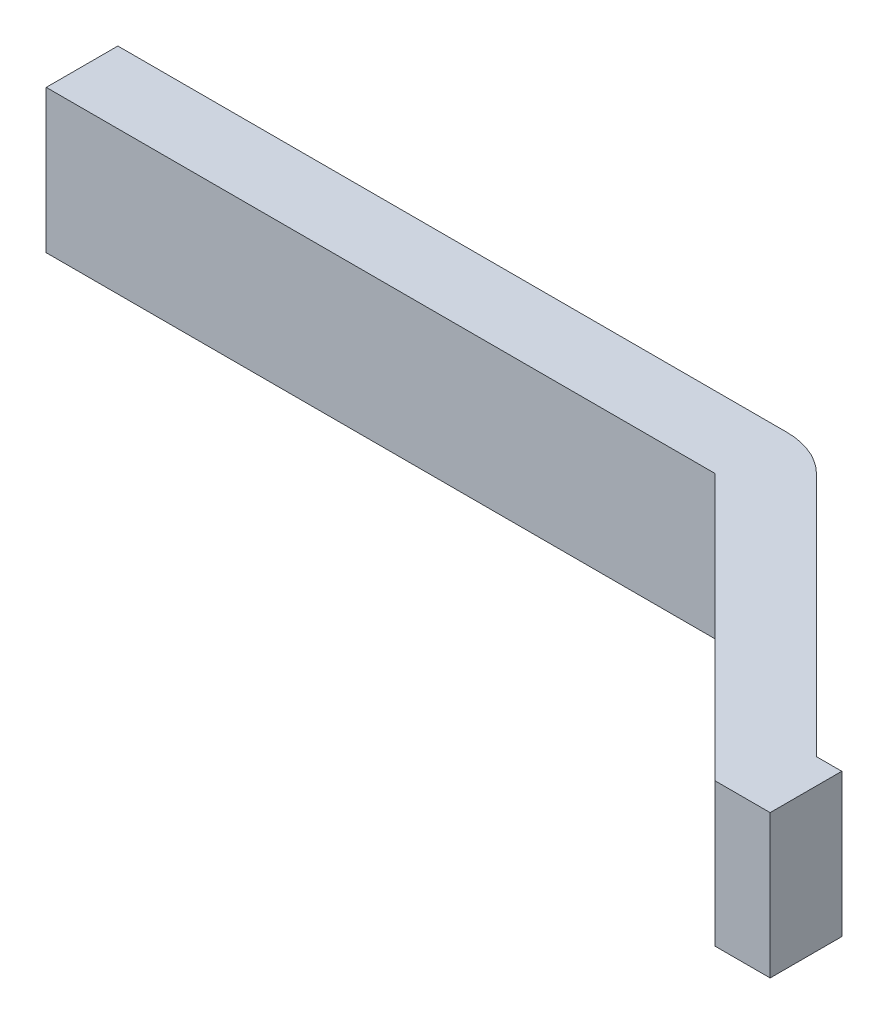
ISO-10303-21;
HEADER;
FILE_DESCRIPTION(('STEP AP214'),'2;1');
FILE_NAME('part.step','',(''),(''),'','','');
FILE_SCHEMA(('AUTOMOTIVE_DESIGN { 1 0 10303 214 1 1 1 1 }'));
ENDSEC;
DATA;
#1=APPLICATION_CONTEXT('core data for automotive mechanical design processes');
#2=APPLICATION_PROTOCOL_DEFINITION('international standard','automotive_design',2000,#1);
#3=PRODUCT_CONTEXT('',#1,'mechanical');
#4=PRODUCT('Part','Part','',(#3));
#5=PRODUCT_RELATED_PRODUCT_CATEGORY('part','',(#4));
#6=PRODUCT_DEFINITION_FORMATION('','',#4);
#7=PRODUCT_DEFINITION_CONTEXT('part definition',#1,'design');
#8=PRODUCT_DEFINITION('design','',#6,#7);
#9=PRODUCT_DEFINITION_SHAPE('','',#8);
#10=(LENGTH_UNIT() NAMED_UNIT(*) SI_UNIT(.MILLI.,.METRE.));
#11=(NAMED_UNIT(*) PLANE_ANGLE_UNIT() SI_UNIT($,.RADIAN.));
#12=(NAMED_UNIT(*) SI_UNIT($,.STERADIAN.) SOLID_ANGLE_UNIT());
#13=UNCERTAINTY_MEASURE_WITH_UNIT(LENGTH_MEASURE(1.E-05),#10,'distance_accuracy_value','');
#14=(GEOMETRIC_REPRESENTATION_CONTEXT(3) GLOBAL_UNCERTAINTY_ASSIGNED_CONTEXT((#13)) GLOBAL_UNIT_ASSIGNED_CONTEXT((#10,
#11,#12)) REPRESENTATION_CONTEXT('',''));
#15=CARTESIAN_POINT('',(0.,0.,0.));
#16=DIRECTION('',(0.,0.,1.));
#17=DIRECTION('',(1.,0.,0.));
#18=AXIS2_PLACEMENT_3D('',#15,#16,#17);
#19=CARTESIAN_POINT('',(-1.11022302462516E-13,256.041777660188,0.));
#20=DIRECTION('',(0.,-1.,0.));
#21=DIRECTION('',(1.,0.,0.));
#22=AXIS2_PLACEMENT_3D('',#19,#20,#21);
#23=PLANE('',#22);
#24=DIRECTION('',(0.,0.,-1.));
#25=VECTOR('',#24,1.);
#26=CARTESIAN_POINT('',(3796.,256.041777660186,30.7499999999718));
#27=LINE('',#26,#25);
#28=CARTESIAN_POINT('',(3796.,256.041777660189,152.));
#29=VERTEX_POINT('',#28);
#30=CARTESIAN_POINT('',(3796.,256.041777660186,-98.0000000001128));
#31=VERTEX_POINT('',#30);
#32=EDGE_CURVE('E11',#29,#31,#27,.T.);
#33=ORIENTED_EDGE('',*,*,#32,.T.);
#34=DIRECTION('',(1.,0.,0.));
#35=VECTOR('',#34,1.);
#36=CARTESIAN_POINT('',(3065.38834764833,256.04177766019,-98.0000000001123));
#37=LINE('',#36,#35);
#38=CARTESIAN_POINT('',(3707.55339059332,256.041777660186,-98.0000000001128));
#39=VERTEX_POINT('',#38);
#40=EDGE_CURVE('E28',#39,#31,#37,.T.);
#41=ORIENTED_EDGE('',*,*,#40,.F.);
#42=DIRECTION('',(0.707106781186547,0.,0.707106781186548));
#43=VECTOR('',#42,1.);
#44=CARTESIAN_POINT('',(2934.47086912087,256.04177766019,-871.082521472566));
#45=LINE('',#44,#43);
#46=CARTESIAN_POINT('',(2851.77669529672,256.041777660186,-953.776695296717));
#47=VERTEX_POINT('',#46);
#48=EDGE_CURVE('E37',#47,#39,#45,.T.);
#49=ORIENTED_EDGE('',*,*,#48,.F.);
#50=CARTESIAN_POINT('',(2675.,256.04177766019,-777.));
#51=DIRECTION('',(0.,-1.,0.));
#52=DIRECTION('',(0.,0.,-1.));
#53=AXIS2_PLACEMENT_3D('',#50,#51,#52);
#54=CIRCLE('',#53,250.);
#55=CARTESIAN_POINT('',(2675.,256.041777660186,-1027.));
#56=VERTEX_POINT('',#55);
#57=EDGE_CURVE('E124',#56,#47,#54,.T.);
#58=ORIENTED_EDGE('',*,*,#57,.F.);
#59=DIRECTION('',(1.,0.,0.));
#60=VECTOR('',#59,1.);
#61=CARTESIAN_POINT('',(1775.,256.04177766019,-1027.));
#62=LINE('',#61,#60);
#63=CARTESIAN_POINT('',(340.,256.041777660191,-1027.));
#64=VERTEX_POINT('',#63);
#65=EDGE_CURVE('E103',#64,#56,#62,.T.);
#66=ORIENTED_EDGE('',*,*,#65,.F.);
#67=DIRECTION('',(0.,0.,-1.));
#68=VECTOR('',#67,1.);
#69=CARTESIAN_POINT('',(340.,256.041777660188,0.));
#70=LINE('',#69,#68);
#71=CARTESIAN_POINT('',(340.,256.041777660191,-777.));
#72=VERTEX_POINT('',#71);
#73=EDGE_CURVE('E101',#72,#64,#70,.T.);
#74=ORIENTED_EDGE('',*,*,#73,.F.);
#75=DIRECTION('',(-1.,0.,0.));
#76=VECTOR('',#75,1.);
#77=CARTESIAN_POINT('',(1775.,256.04177766019,-777.));
#78=LINE('',#77,#76);
#79=CARTESIAN_POINT('',(2675.,256.041777660186,-777.));
#80=VERTEX_POINT('',#79);
#81=EDGE_CURVE('E129',#80,#72,#78,.T.);
#82=ORIENTED_EDGE('',*,*,#81,.F.);
#83=DIRECTION('',(-0.707106781186547,0.,-0.707106781186548));
#84=VECTOR('',#83,1.);
#85=CARTESIAN_POINT('',(2776.,256.04177766019,-676.));
#86=LINE('',#85,#84);
#87=CARTESIAN_POINT('',(3604.,256.041777660186,152.));
#88=VERTEX_POINT('',#87);
#89=EDGE_CURVE('E135',#88,#80,#86,.T.);
#90=ORIENTED_EDGE('',*,*,#89,.F.);
#91=DIRECTION('',(-1.,0.,0.));
#92=VECTOR('',#91,1.);
#93=CARTESIAN_POINT('',(3039.5,256.04177766019,152.));
#94=LINE('',#93,#92);
#95=EDGE_CURVE('E141',#29,#88,#94,.T.);
#96=ORIENTED_EDGE('',*,*,#95,.F.);
#97=EDGE_LOOP('',(#33,#41,#49,#58,#66,#74,#82,#90,#96));
#98=FACE_BOUND('',#97,.T.);
#99=ADVANCED_FACE('F17',(#98),#23,.F.);
#100=CARTESIAN_POINT('',(3855.77669529665,-243.958222339811,-98.0000000001128));
#101=DIRECTION('',(0.,0.,-1.));
#102=DIRECTION('',(1.,0.,0.));
#103=AXIS2_PLACEMENT_3D('',#100,#101,#102);
#104=PLANE('',#103);
#105=DIRECTION('',(0.,1.,0.));
#106=VECTOR('',#105,1.);
#107=CARTESIAN_POINT('',(3796.,-243.958222339811,-98.0000000001128));
#108=LINE('',#107,#106);
#109=CARTESIAN_POINT('',(3796.,-243.958222339811,-98.0000000001127));
#110=VERTEX_POINT('',#109);
#111=EDGE_CURVE('E104',#110,#31,#108,.T.);
#112=ORIENTED_EDGE('',*,*,#111,.F.);
#113=DIRECTION('',(-1.,0.,0.));
#114=VECTOR('',#113,1.);
#115=CARTESIAN_POINT('',(4004.,-243.958222339811,-98.0000000001129));
#116=LINE('',#115,#114);
#117=CARTESIAN_POINT('',(3707.55339059332,-243.958222339811,-98.0000000001128));
#118=VERTEX_POINT('',#117);
#119=EDGE_CURVE('E120',#110,#118,#116,.T.);
#120=ORIENTED_EDGE('',*,*,#119,.T.);
#121=DIRECTION('',(0.,1.,0.));
#122=VECTOR('',#121,1.);
#123=CARTESIAN_POINT('',(3707.55339059332,-243.958222339811,-98.0000000001128));
#124=LINE('',#123,#122);
#125=EDGE_CURVE('E149',#118,#39,#124,.T.);
#126=ORIENTED_EDGE('',*,*,#125,.T.);
#127=ORIENTED_EDGE('',*,*,#40,.T.);
#128=EDGE_LOOP('',(#112,#120,#126,#127));
#129=FACE_BOUND('',#128,.T.);
#130=ADVANCED_FACE('F205',(#129),#104,.T.);
#131=CARTESIAN_POINT('',(-1.11022302462516E-13,-243.958222339809,0.));
#132=DIRECTION('',(0.,-1.,0.));
#133=DIRECTION('',(1.,0.,0.));
#134=AXIS2_PLACEMENT_3D('',#131,#132,#133);
#135=PLANE('',#134);
#136=DIRECTION('',(0.,0.,1.));
#137=VECTOR('',#136,1.);
#138=CARTESIAN_POINT('',(3796.,-243.958222339811,30.7499999999718));
#139=LINE('',#138,#137);
#140=CARTESIAN_POINT('',(3796.,-243.958222339811,152.));
#141=VERTEX_POINT('',#140);
#142=EDGE_CURVE('E153',#110,#141,#139,.T.);
#143=ORIENTED_EDGE('',*,*,#142,.T.);
#144=DIRECTION('',(1.,0.,0.));
#145=VECTOR('',#144,1.);
#146=CARTESIAN_POINT('',(3604.,-243.958222339811,152.));
#147=LINE('',#146,#145);
#148=CARTESIAN_POINT('',(3604.,-243.958222339811,152.));
#149=VERTEX_POINT('',#148);
#150=EDGE_CURVE('E139',#149,#141,#147,.T.);
#151=ORIENTED_EDGE('',*,*,#150,.F.);
#152=DIRECTION('',(0.707106781186547,0.,0.707106781186548));
#153=VECTOR('',#152,1.);
#154=CARTESIAN_POINT('',(2675.,-243.95822233981,-777.));
#155=LINE('',#154,#153);
#156=CARTESIAN_POINT('',(2675.,-243.95822233981,-777.));
#157=VERTEX_POINT('',#156);
#158=EDGE_CURVE('E140',#157,#149,#155,.T.);
#159=ORIENTED_EDGE('',*,*,#158,.F.);
#160=DIRECTION('',(-1.,0.,0.));
#161=VECTOR('',#160,1.);
#162=CARTESIAN_POINT('',(2675.,-243.95822233981,-777.));
#163=LINE('',#162,#161);
#164=CARTESIAN_POINT('',(340.,-243.958222339809,-777.));
#165=VERTEX_POINT('',#164);
#166=EDGE_CURVE('E95',#157,#165,#163,.T.);
#167=ORIENTED_EDGE('',*,*,#166,.T.);
#168=DIRECTION('',(0.,0.,-1.));
#169=VECTOR('',#168,1.);
#170=CARTESIAN_POINT('',(340.,-243.958222339809,0.));
#171=LINE('',#170,#169);
#172=CARTESIAN_POINT('',(340.,-243.958222339809,-1027.));
#173=VERTEX_POINT('',#172);
#174=EDGE_CURVE('E88',#165,#173,#171,.T.);
#175=ORIENTED_EDGE('',*,*,#174,.T.);
#176=DIRECTION('',(1.,0.,0.));
#177=VECTOR('',#176,1.);
#178=CARTESIAN_POINT('',(-125.,-243.958222339809,-1027.));
#179=LINE('',#178,#177);
#180=CARTESIAN_POINT('',(2675.,-243.95822233981,-1027.));
#181=VERTEX_POINT('',#180);
#182=EDGE_CURVE('E79',#173,#181,#179,.T.);
#183=ORIENTED_EDGE('',*,*,#182,.T.);
#184=CARTESIAN_POINT('',(2675.,-243.95822233981,-777.));
#185=DIRECTION('',(0.,-1.,0.));
#186=DIRECTION('',(0.,0.,-1.));
#187=AXIS2_PLACEMENT_3D('',#184,#185,#186);
#188=CIRCLE('',#187,250.);
#189=CARTESIAN_POINT('',(2851.77669529672,-243.95822233981,-953.776695296717));
#190=VERTEX_POINT('',#189);
#191=EDGE_CURVE('E89',#181,#190,#188,.T.);
#192=ORIENTED_EDGE('',*,*,#191,.T.);
#193=DIRECTION('',(0.707106781186547,0.,0.707106781186548));
#194=VECTOR('',#193,1.);
#195=CARTESIAN_POINT('',(2851.77669529672,-243.95822233981,-953.776695296717));
#196=LINE('',#195,#194);
#197=EDGE_CURVE('E127',#190,#118,#196,.T.);
#198=ORIENTED_EDGE('',*,*,#197,.T.);
#199=ORIENTED_EDGE('',*,*,#119,.F.);
#200=EDGE_LOOP('',(#143,#151,#159,#167,#175,#183,#192,#198,#199));
#201=FACE_BOUND('',#200,.T.);
#202=ADVANCED_FACE('F93',(#201),#135,.T.);
#203=CARTESIAN_POINT('',(2675.,-243.95822233981,-777.));
#204=DIRECTION('',(0.,1.,0.));
#205=DIRECTION('',(0.,0.,1.));
#206=AXIS2_PLACEMENT_3D('',#203,#204,#205);
#207=CYLINDRICAL_SURFACE('',#206,250.);
#208=ORIENTED_EDGE('',*,*,#57,.T.);
#209=DIRECTION('',(0.,1.,0.));
#210=VECTOR('',#209,1.);
#211=CARTESIAN_POINT('',(2851.77669529672,-243.95822233981,-953.776695296717));
#212=LINE('',#211,#210);
#213=EDGE_CURVE('E123',#190,#47,#212,.T.);
#214=ORIENTED_EDGE('',*,*,#213,.F.);
#215=ORIENTED_EDGE('',*,*,#191,.F.);
#216=DIRECTION('',(0.,1.,0.));
#217=VECTOR('',#216,1.);
#218=CARTESIAN_POINT('',(2675.,-243.95822233981,-1027.));
#219=LINE('',#218,#217);
#220=EDGE_CURVE('E84',#181,#56,#219,.T.);
#221=ORIENTED_EDGE('',*,*,#220,.T.);
#222=EDGE_LOOP('',(#208,#214,#215,#221));
#223=FACE_BOUND('',#222,.T.);
#224=ADVANCED_FACE('F209',(#223),#207,.T.);
#225=CARTESIAN_POINT('',(3279.66504294502,-243.95822233981,-525.888347648415));
#226=DIRECTION('',(0.707106781186548,0.,-0.707106781186547));
#227=DIRECTION('',(0.,1.,0.));
#228=AXIS2_PLACEMENT_3D('',#225,#226,#227);
#229=PLANE('',#228);
#230=ORIENTED_EDGE('',*,*,#48,.T.);
#231=ORIENTED_EDGE('',*,*,#125,.F.);
#232=ORIENTED_EDGE('',*,*,#197,.F.);
#233=ORIENTED_EDGE('',*,*,#213,.T.);
#234=EDGE_LOOP('',(#230,#231,#232,#233));
#235=FACE_BOUND('',#234,.T.);
#236=ADVANCED_FACE('F210',(#235),#229,.T.);
#237=CARTESIAN_POINT('',(3804.,-243.958222339811,152.));
#238=DIRECTION('',(0.,0.,1.));
#239=DIRECTION('',(-1.,0.,0.));
#240=AXIS2_PLACEMENT_3D('',#237,#238,#239);
#241=PLANE('',#240);
#242=DIRECTION('',(0.,1.,0.));
#243=VECTOR('',#242,1.);
#244=CARTESIAN_POINT('',(3796.,-118.958222339812,152.));
#245=LINE('',#244,#243);
#246=EDGE_CURVE('E145',#141,#29,#245,.T.);
#247=ORIENTED_EDGE('',*,*,#246,.T.);
#248=ORIENTED_EDGE('',*,*,#95,.T.);
#249=DIRECTION('',(0.,1.,0.));
#250=VECTOR('',#249,1.);
#251=CARTESIAN_POINT('',(3604.,-243.958222339811,152.));
#252=LINE('',#251,#250);
#253=EDGE_CURVE('E133',#149,#88,#252,.T.);
#254=ORIENTED_EDGE('',*,*,#253,.F.);
#255=ORIENTED_EDGE('',*,*,#150,.T.);
#256=EDGE_LOOP('',(#247,#248,#254,#255));
#257=FACE_BOUND('',#256,.T.);
#258=ADVANCED_FACE('F196',(#257),#241,.T.);
#259=CARTESIAN_POINT('',(3139.5,-243.95822233981,-312.5));
#260=DIRECTION('',(-0.707106781186548,0.,0.707106781186547));
#261=DIRECTION('',(0.,-1.,0.));
#262=AXIS2_PLACEMENT_3D('',#259,#260,#261);
#263=PLANE('',#262);
#264=ORIENTED_EDGE('',*,*,#89,.T.);
#265=DIRECTION('',(0.,1.,0.));
#266=VECTOR('',#265,1.);
#267=CARTESIAN_POINT('',(2675.,-243.95822233981,-777.));
#268=LINE('',#267,#266);
#269=EDGE_CURVE('E134',#157,#80,#268,.T.);
#270=ORIENTED_EDGE('',*,*,#269,.F.);
#271=ORIENTED_EDGE('',*,*,#158,.T.);
#272=ORIENTED_EDGE('',*,*,#253,.T.);
#273=EDGE_LOOP('',(#264,#270,#271,#272));
#274=FACE_BOUND('',#273,.T.);
#275=ADVANCED_FACE('F192',(#274),#263,.T.);
#276=CARTESIAN_POINT('',(1275.,-243.95822233981,-777.));
#277=DIRECTION('',(0.,0.,1.));
#278=DIRECTION('',(-1.,0.,0.));
#279=AXIS2_PLACEMENT_3D('',#276,#277,#278);
#280=PLANE('',#279);
#281=ORIENTED_EDGE('',*,*,#81,.T.);
#282=DIRECTION('',(0.,1.,0.));
#283=VECTOR('',#282,1.);
#284=CARTESIAN_POINT('',(340.,-243.958222339809,-777.));
#285=LINE('',#284,#283);
#286=EDGE_CURVE('E108',#165,#72,#285,.T.);
#287=ORIENTED_EDGE('',*,*,#286,.F.);
#288=ORIENTED_EDGE('',*,*,#166,.F.);
#289=ORIENTED_EDGE('',*,*,#269,.T.);
#290=EDGE_LOOP('',(#281,#287,#288,#289));
#291=FACE_BOUND('',#290,.T.);
#292=ADVANCED_FACE('F186',(#291),#280,.T.);
#293=CARTESIAN_POINT('',(340.,-243.958222339809,-902.));
#294=DIRECTION('',(-1.,0.,0.));
#295=DIRECTION('',(0.,0.,-1.));
#296=AXIS2_PLACEMENT_3D('',#293,#294,#295);
#297=PLANE('',#296);
#298=ORIENTED_EDGE('',*,*,#73,.T.);
#299=DIRECTION('',(0.,1.,0.));
#300=VECTOR('',#299,1.);
#301=CARTESIAN_POINT('',(340.,-243.95822233981,-1027.));
#302=LINE('',#301,#300);
#303=EDGE_CURVE('E21',#173,#64,#302,.T.);
#304=ORIENTED_EDGE('',*,*,#303,.F.);
#305=ORIENTED_EDGE('',*,*,#174,.F.);
#306=ORIENTED_EDGE('',*,*,#286,.T.);
#307=EDGE_LOOP('',(#298,#304,#305,#306));
#308=FACE_BOUND('',#307,.T.);
#309=ADVANCED_FACE('F19',(#308),#297,.T.);
#310=CARTESIAN_POINT('',(1275.,-243.95822233981,-1027.));
#311=DIRECTION('',(0.,0.,-1.));
#312=DIRECTION('',(0.,1.,0.));
#313=AXIS2_PLACEMENT_3D('',#310,#311,#312);
#314=PLANE('',#313);
#315=ORIENTED_EDGE('',*,*,#65,.T.);
#316=ORIENTED_EDGE('',*,*,#220,.F.);
#317=ORIENTED_EDGE('',*,*,#182,.F.);
#318=ORIENTED_EDGE('',*,*,#303,.T.);
#319=EDGE_LOOP('',(#315,#316,#317,#318));
#320=FACE_BOUND('',#319,.T.);
#321=ADVANCED_FACE('F81',(#320),#314,.T.);
#322=CARTESIAN_POINT('',(3796.,410.651777660188,-1027.));
#323=DIRECTION('',(-1.,0.,0.));
#324=DIRECTION('',(0.,0.,1.));
#325=AXIS2_PLACEMENT_3D('',#322,#323,#324);
#326=PLANE('',#325);
#327=ORIENTED_EDGE('',*,*,#246,.F.);
#328=ORIENTED_EDGE('',*,*,#142,.F.);
#329=ORIENTED_EDGE('',*,*,#111,.T.);
#330=ORIENTED_EDGE('',*,*,#32,.F.);
#331=EDGE_LOOP('',(#327,#328,#329,#330));
#332=FACE_BOUND('',#331,.T.);
#333=ADVANCED_FACE('F199',(#332),#326,.F.);
#334=CLOSED_SHELL('',(#99,#130,#202,#224,#236,#258,#275,#292,#309,#321,#333));
#335=MANIFOLD_SOLID_BREP('B1',#334);
#336=ADVANCED_BREP_SHAPE_REPRESENTATION('',(#18,#335),#14);
#337=SHAPE_DEFINITION_REPRESENTATION(#9,#336);
ENDSEC;
END-ISO-10303-21;
